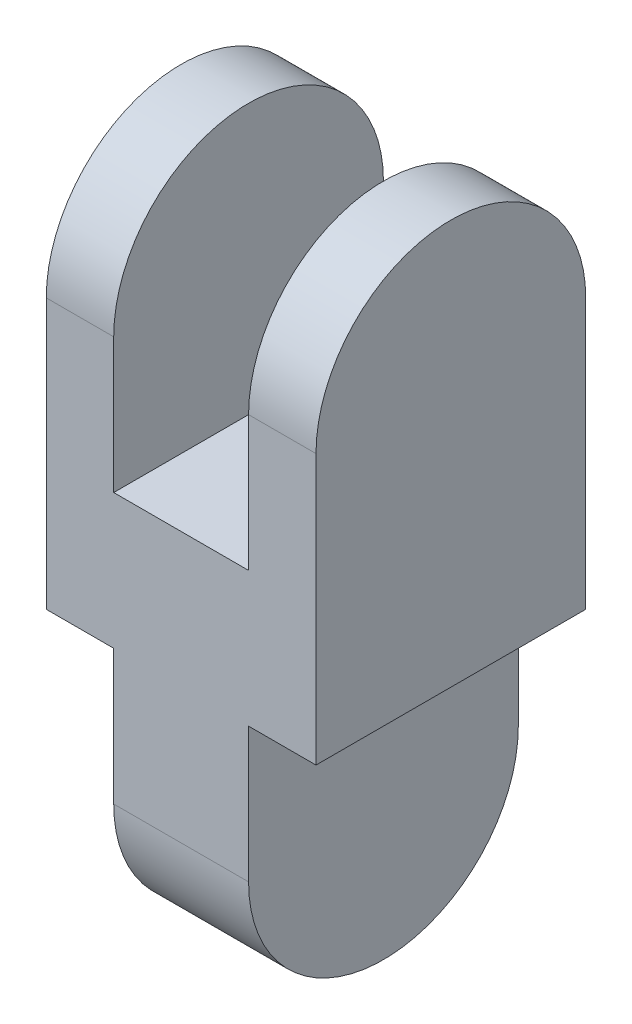
ISO-10303-21;
HEADER;
FILE_DESCRIPTION(('STEP AP214'),'2;1');
FILE_NAME('part.step','',(''),(''),'','','');
FILE_SCHEMA(('AUTOMOTIVE_DESIGN { 1 0 10303 214 1 1 1 1 }'));
ENDSEC;
DATA;
#1=APPLICATION_CONTEXT('core data for automotive mechanical design processes');
#2=APPLICATION_PROTOCOL_DEFINITION('international standard','automotive_design',2000,#1);
#3=PRODUCT_CONTEXT('',#1,'mechanical');
#4=PRODUCT('Part','Part','',(#3));
#5=PRODUCT_RELATED_PRODUCT_CATEGORY('part','',(#4));
#6=PRODUCT_DEFINITION_FORMATION('','',#4);
#7=PRODUCT_DEFINITION_CONTEXT('part definition',#1,'design');
#8=PRODUCT_DEFINITION('design','',#6,#7);
#9=PRODUCT_DEFINITION_SHAPE('','',#8);
#10=(LENGTH_UNIT() NAMED_UNIT(*) SI_UNIT(.MILLI.,.METRE.));
#11=(NAMED_UNIT(*) PLANE_ANGLE_UNIT() SI_UNIT($,.RADIAN.));
#12=(NAMED_UNIT(*) SI_UNIT($,.STERADIAN.) SOLID_ANGLE_UNIT());
#13=UNCERTAINTY_MEASURE_WITH_UNIT(LENGTH_MEASURE(1.E-05),#10,'distance_accuracy_value','');
#14=(GEOMETRIC_REPRESENTATION_CONTEXT(3) GLOBAL_UNCERTAINTY_ASSIGNED_CONTEXT((#13)) GLOBAL_UNIT_ASSIGNED_CONTEXT((#10,
#11,#12)) REPRESENTATION_CONTEXT('',''));
#15=CARTESIAN_POINT('',(0.,0.,0.));
#16=DIRECTION('',(0.,0.,1.));
#17=DIRECTION('',(1.,0.,0.));
#18=AXIS2_PLACEMENT_3D('',#15,#16,#17);
#19=CARTESIAN_POINT('',(-8.,40.,-8.));
#20=DIRECTION('',(0.,0.,1.));
#21=DIRECTION('',(1.,0.,0.));
#22=AXIS2_PLACEMENT_3D('',#19,#20,#21);
#23=PLANE('',#22);
#24=DIRECTION('',(0.,1.,0.));
#25=VECTOR('',#24,1.);
#26=CARTESIAN_POINT('',(-4.,32.,-8.00000000000001));
#27=LINE('',#26,#25);
#28=CARTESIAN_POINT('',(-4.,24.,-8.00000000000001));
#29=VERTEX_POINT('',#28);
#30=CARTESIAN_POINT('',(-4.,32.,-8.00000000000001));
#31=VERTEX_POINT('',#30);
#32=EDGE_CURVE('E135',#29,#31,#27,.T.);
#33=ORIENTED_EDGE('',*,*,#32,.F.);
#34=DIRECTION('',(1.,0.,0.));
#35=VECTOR('',#34,1.);
#36=CARTESIAN_POINT('',(-4.,24.,-8.00000000000001));
#37=LINE('',#36,#35);
#38=CARTESIAN_POINT('',(4.,24.,-8.00000000000001));
#39=VERTEX_POINT('',#38);
#40=EDGE_CURVE('E238',#29,#39,#37,.T.);
#41=ORIENTED_EDGE('',*,*,#40,.T.);
#42=DIRECTION('',(0.,1.,0.));
#43=VECTOR('',#42,1.);
#44=CARTESIAN_POINT('',(4.,32.,-8.00000000000001));
#45=LINE('',#44,#43);
#46=CARTESIAN_POINT('',(4.,32.,-8.00000000000001));
#47=VERTEX_POINT('',#46);
#48=EDGE_CURVE('E139',#39,#47,#45,.T.);
#49=ORIENTED_EDGE('',*,*,#48,.T.);
#50=DIRECTION('',(1.,0.,0.));
#51=VECTOR('',#50,1.);
#52=CARTESIAN_POINT('',(-8.00000000000001,32.,-8.));
#53=LINE('',#52,#51);
#54=CARTESIAN_POINT('',(8.,32.,-8.));
#55=VERTEX_POINT('',#54);
#56=EDGE_CURVE('E61',#47,#55,#53,.T.);
#57=ORIENTED_EDGE('',*,*,#56,.T.);
#58=DIRECTION('',(0.,-1.,0.));
#59=VECTOR('',#58,1.);
#60=CARTESIAN_POINT('',(8.,40.,-8.));
#61=LINE('',#60,#59);
#62=CARTESIAN_POINT('',(8.,16.,-8.00000000000001));
#63=VERTEX_POINT('',#62);
#64=EDGE_CURVE('E206',#55,#63,#61,.T.);
#65=ORIENTED_EDGE('',*,*,#64,.T.);
#66=DIRECTION('',(1.,0.,0.));
#67=VECTOR('',#66,1.);
#68=CARTESIAN_POINT('',(4.,16.,-8.00000000000001));
#69=LINE('',#68,#67);
#70=CARTESIAN_POINT('',(4.,16.,-8.00000000000001));
#71=VERTEX_POINT('',#70);
#72=EDGE_CURVE('E172',#71,#63,#69,.T.);
#73=ORIENTED_EDGE('',*,*,#72,.F.);
#74=DIRECTION('',(0.,1.,0.));
#75=VECTOR('',#74,1.);
#76=CARTESIAN_POINT('',(4.,8.,-8.00000000000001));
#77=LINE('',#76,#75);
#78=CARTESIAN_POINT('',(4.,8.,-8.));
#79=VERTEX_POINT('',#78);
#80=EDGE_CURVE('E165',#79,#71,#77,.T.);
#81=ORIENTED_EDGE('',*,*,#80,.F.);
#82=DIRECTION('',(1.,0.,0.));
#83=VECTOR('',#82,1.);
#84=CARTESIAN_POINT('',(-32.,8.,-7.99999999999999));
#85=LINE('',#84,#83);
#86=CARTESIAN_POINT('',(-4.,8.,-8.));
#87=VERTEX_POINT('',#86);
#88=EDGE_CURVE('E199',#87,#79,#85,.T.);
#89=ORIENTED_EDGE('',*,*,#88,.F.);
#90=DIRECTION('',(0.,-1.,0.));
#91=VECTOR('',#90,1.);
#92=CARTESIAN_POINT('',(-4.,8.,-8.));
#93=LINE('',#92,#91);
#94=CARTESIAN_POINT('',(-4.,16.,-8.));
#95=VERTEX_POINT('',#94);
#96=EDGE_CURVE('E188',#95,#87,#93,.T.);
#97=ORIENTED_EDGE('',*,*,#96,.F.);
#98=DIRECTION('',(-1.,0.,0.));
#99=VECTOR('',#98,1.);
#100=CARTESIAN_POINT('',(-4.,16.,-8.));
#101=LINE('',#100,#99);
#102=CARTESIAN_POINT('',(-8.,16.,-8.));
#103=VERTEX_POINT('',#102);
#104=EDGE_CURVE('E193',#95,#103,#101,.T.);
#105=ORIENTED_EDGE('',*,*,#104,.T.);
#106=DIRECTION('',(0.,-1.,0.));
#107=VECTOR('',#106,1.);
#108=CARTESIAN_POINT('',(-8.,40.,-8.));
#109=LINE('',#108,#107);
#110=CARTESIAN_POINT('',(-8.00000000000001,32.,-8.));
#111=VERTEX_POINT('',#110);
#112=EDGE_CURVE('E202',#111,#103,#109,.T.);
#113=ORIENTED_EDGE('',*,*,#112,.F.);
#114=EDGE_CURVE('E158',#111,#31,#53,.T.);
#115=ORIENTED_EDGE('',*,*,#114,.T.);
#116=EDGE_LOOP('',(#33,#41,#49,#57,#65,#73,#81,#89,#97,#105,#113,#115));
#117=FACE_BOUND('',#116,.T.);
#118=ADVANCED_FACE('F38',(#117),#23,.F.);
#119=CARTESIAN_POINT('',(-8.,40.,8.));
#120=DIRECTION('',(0.,0.,-1.));
#121=DIRECTION('',(-1.,0.,0.));
#122=AXIS2_PLACEMENT_3D('',#119,#120,#121);
#123=PLANE('',#122);
#124=DIRECTION('',(0.,-1.,0.));
#125=VECTOR('',#124,1.);
#126=CARTESIAN_POINT('',(-4.,32.,8.));
#127=LINE('',#126,#125);
#128=CARTESIAN_POINT('',(-4.,32.,8.));
#129=VERTEX_POINT('',#128);
#130=CARTESIAN_POINT('',(-4.,24.,8.));
#131=VERTEX_POINT('',#130);
#132=EDGE_CURVE('E132',#129,#131,#127,.T.);
#133=ORIENTED_EDGE('',*,*,#132,.F.);
#134=DIRECTION('',(1.,0.,0.));
#135=VECTOR('',#134,1.);
#136=CARTESIAN_POINT('',(-8.,32.,8.));
#137=LINE('',#136,#135);
#138=CARTESIAN_POINT('',(-8.,32.,8.));
#139=VERTEX_POINT('',#138);
#140=EDGE_CURVE('E144',#139,#129,#137,.T.);
#141=ORIENTED_EDGE('',*,*,#140,.F.);
#142=DIRECTION('',(0.,-1.,0.));
#143=VECTOR('',#142,1.);
#144=CARTESIAN_POINT('',(-8.,40.,8.));
#145=LINE('',#144,#143);
#146=CARTESIAN_POINT('',(-8.,16.,8.));
#147=VERTEX_POINT('',#146);
#148=EDGE_CURVE('E11',#139,#147,#145,.T.);
#149=ORIENTED_EDGE('',*,*,#148,.T.);
#150=DIRECTION('',(-1.,0.,0.));
#151=VECTOR('',#150,1.);
#152=CARTESIAN_POINT('',(-4.,16.,8.));
#153=LINE('',#152,#151);
#154=CARTESIAN_POINT('',(-4.,16.,8.));
#155=VERTEX_POINT('',#154);
#156=EDGE_CURVE('E190',#155,#147,#153,.T.);
#157=ORIENTED_EDGE('',*,*,#156,.F.);
#158=DIRECTION('',(0.,1.,0.));
#159=VECTOR('',#158,1.);
#160=CARTESIAN_POINT('',(-4.,8.,8.));
#161=LINE('',#160,#159);
#162=CARTESIAN_POINT('',(-4.,8.,8.));
#163=VERTEX_POINT('',#162);
#164=EDGE_CURVE('E182',#163,#155,#161,.T.);
#165=ORIENTED_EDGE('',*,*,#164,.F.);
#166=DIRECTION('',(1.,0.,0.));
#167=VECTOR('',#166,1.);
#168=CARTESIAN_POINT('',(-32.,8.,8.00000000000001));
#169=LINE('',#168,#167);
#170=CARTESIAN_POINT('',(4.,8.,8.));
#171=VERTEX_POINT('',#170);
#172=EDGE_CURVE('E196',#163,#171,#169,.T.);
#173=ORIENTED_EDGE('',*,*,#172,.T.);
#174=DIRECTION('',(0.,-1.,0.));
#175=VECTOR('',#174,1.);
#176=CARTESIAN_POINT('',(4.,8.,8.));
#177=LINE('',#176,#175);
#178=CARTESIAN_POINT('',(4.,16.,8.));
#179=VERTEX_POINT('',#178);
#180=EDGE_CURVE('E171',#179,#171,#177,.T.);
#181=ORIENTED_EDGE('',*,*,#180,.F.);
#182=DIRECTION('',(1.,0.,0.));
#183=VECTOR('',#182,1.);
#184=CARTESIAN_POINT('',(4.,16.,8.));
#185=LINE('',#184,#183);
#186=CARTESIAN_POINT('',(8.,16.,8.));
#187=VERTEX_POINT('',#186);
#188=EDGE_CURVE('E174',#179,#187,#185,.T.);
#189=ORIENTED_EDGE('',*,*,#188,.T.);
#190=DIRECTION('',(0.,-1.,0.));
#191=VECTOR('',#190,1.);
#192=CARTESIAN_POINT('',(8.,40.,8.));
#193=LINE('',#192,#191);
#194=CARTESIAN_POINT('',(8.,32.,8.));
#195=VERTEX_POINT('',#194);
#196=EDGE_CURVE('E46',#195,#187,#193,.T.);
#197=ORIENTED_EDGE('',*,*,#196,.F.);
#198=CARTESIAN_POINT('',(4.,32.,8.));
#199=VERTEX_POINT('',#198);
#200=EDGE_CURVE('E153',#199,#195,#137,.T.);
#201=ORIENTED_EDGE('',*,*,#200,.F.);
#202=DIRECTION('',(0.,-1.,0.));
#203=VECTOR('',#202,1.);
#204=CARTESIAN_POINT('',(4.,32.,8.));
#205=LINE('',#204,#203);
#206=CARTESIAN_POINT('',(4.,24.,8.));
#207=VERTEX_POINT('',#206);
#208=EDGE_CURVE('E53',#199,#207,#205,.T.);
#209=ORIENTED_EDGE('',*,*,#208,.T.);
#210=DIRECTION('',(1.,0.,0.));
#211=VECTOR('',#210,1.);
#212=CARTESIAN_POINT('',(-4.,24.,8.));
#213=LINE('',#212,#211);
#214=EDGE_CURVE('E146',#131,#207,#213,.T.);
#215=ORIENTED_EDGE('',*,*,#214,.F.);
#216=EDGE_LOOP('',(#133,#141,#149,#157,#165,#173,#181,#189,#197,#201,#209,#215));
#217=FACE_BOUND('',#216,.T.);
#218=ADVANCED_FACE('F143',(#217),#123,.F.);
#219=CARTESIAN_POINT('',(-8.,32.,0.));
#220=DIRECTION('',(1.,0.,0.));
#221=DIRECTION('',(0.,0.,-1.));
#222=AXIS2_PLACEMENT_3D('',#219,#220,#221);
#223=CYLINDRICAL_SURFACE('',#222,8.);
#224=CARTESIAN_POINT('',(-4.,32.,0.));
#225=DIRECTION('',(1.,0.,0.));
#226=DIRECTION('',(0.,0.,-1.));
#227=AXIS2_PLACEMENT_3D('',#224,#225,#226);
#228=CIRCLE('',#227,8.);
#229=EDGE_CURVE('E128',#31,#129,#228,.T.);
#230=ORIENTED_EDGE('',*,*,#229,.F.);
#231=ORIENTED_EDGE('',*,*,#114,.F.);
#232=CARTESIAN_POINT('',(-8.,32.,0.));
#233=DIRECTION('',(-1.,0.,0.));
#234=DIRECTION('',(0.,0.,-1.));
#235=AXIS2_PLACEMENT_3D('',#232,#233,#234);
#236=CIRCLE('',#235,8.);
#237=EDGE_CURVE('E151',#139,#111,#236,.T.);
#238=ORIENTED_EDGE('',*,*,#237,.F.);
#239=ORIENTED_EDGE('',*,*,#140,.T.);
#240=EDGE_LOOP('',(#230,#231,#238,#239));
#241=FACE_BOUND('',#240,.T.);
#242=ADVANCED_FACE('F149',(#241),#223,.T.);
#243=CARTESIAN_POINT('',(-32.,8.,0.));
#244=DIRECTION('',(1.,0.,0.));
#245=DIRECTION('',(0.,0.,-1.));
#246=AXIS2_PLACEMENT_3D('',#243,#244,#245);
#247=CYLINDRICAL_SURFACE('',#246,8.);
#248=CARTESIAN_POINT('',(4.,8.,0.));
#249=DIRECTION('',(1.,0.,0.));
#250=DIRECTION('',(0.,0.,-1.));
#251=AXIS2_PLACEMENT_3D('',#248,#249,#250);
#252=CIRCLE('',#251,8.);
#253=EDGE_CURVE('E156',#171,#79,#252,.T.);
#254=ORIENTED_EDGE('',*,*,#253,.F.);
#255=ORIENTED_EDGE('',*,*,#172,.F.);
#256=CARTESIAN_POINT('',(-4.,8.,0.));
#257=DIRECTION('',(-1.,0.,0.));
#258=DIRECTION('',(0.,0.,1.));
#259=AXIS2_PLACEMENT_3D('',#256,#257,#258);
#260=CIRCLE('',#259,8.);
#261=EDGE_CURVE('E180',#87,#163,#260,.T.);
#262=ORIENTED_EDGE('',*,*,#261,.F.);
#263=ORIENTED_EDGE('',*,*,#88,.T.);
#264=EDGE_LOOP('',(#254,#255,#262,#263));
#265=FACE_BOUND('',#264,.T.);
#266=ADVANCED_FACE('F225',(#265),#247,.T.);
#267=CARTESIAN_POINT('',(-8.,40.,-8.));
#268=DIRECTION('',(1.,0.,0.));
#269=DIRECTION('',(0.,0.,-1.));
#270=AXIS2_PLACEMENT_3D('',#267,#268,#269);
#271=PLANE('',#270);
#272=ORIENTED_EDGE('',*,*,#148,.F.);
#273=ORIENTED_EDGE('',*,*,#237,.T.);
#274=ORIENTED_EDGE('',*,*,#112,.T.);
#275=DIRECTION('',(0.,0.,-1.));
#276=VECTOR('',#275,1.);
#277=CARTESIAN_POINT('',(-8.,16.,-8.));
#278=LINE('',#277,#276);
#279=EDGE_CURVE('E177',#147,#103,#278,.T.);
#280=ORIENTED_EDGE('',*,*,#279,.F.);
#281=EDGE_LOOP('',(#272,#273,#274,#280));
#282=FACE_BOUND('',#281,.T.);
#283=ADVANCED_FACE('F40',(#282),#271,.F.);
#284=CARTESIAN_POINT('',(8.,40.,-8.));
#285=DIRECTION('',(-1.,0.,0.));
#286=DIRECTION('',(0.,0.,1.));
#287=AXIS2_PLACEMENT_3D('',#284,#285,#286);
#288=PLANE('',#287);
#289=ORIENTED_EDGE('',*,*,#64,.F.);
#290=CARTESIAN_POINT('',(8.,32.,0.));
#291=DIRECTION('',(-1.,0.,0.));
#292=DIRECTION('',(0.,0.,-1.));
#293=AXIS2_PLACEMENT_3D('',#290,#291,#292);
#294=CIRCLE('',#293,8.);
#295=EDGE_CURVE('E161',#195,#55,#294,.T.);
#296=ORIENTED_EDGE('',*,*,#295,.F.);
#297=ORIENTED_EDGE('',*,*,#196,.T.);
#298=DIRECTION('',(0.,0.,1.));
#299=VECTOR('',#298,1.);
#300=CARTESIAN_POINT('',(8.,16.,8.));
#301=LINE('',#300,#299);
#302=EDGE_CURVE('E152',#63,#187,#301,.T.);
#303=ORIENTED_EDGE('',*,*,#302,.F.);
#304=EDGE_LOOP('',(#289,#296,#297,#303));
#305=FACE_BOUND('',#304,.T.);
#306=ADVANCED_FACE('F212',(#305),#288,.F.);
#307=CARTESIAN_POINT('',(-4.,16.,-8.));
#308=DIRECTION('',(0.,1.,0.));
#309=DIRECTION('',(0.,0.,1.));
#310=AXIS2_PLACEMENT_3D('',#307,#308,#309);
#311=PLANE('',#310);
#312=ORIENTED_EDGE('',*,*,#279,.T.);
#313=ORIENTED_EDGE('',*,*,#104,.F.);
#314=DIRECTION('',(0.,0.,-1.));
#315=VECTOR('',#314,1.);
#316=CARTESIAN_POINT('',(-4.,16.,-8.));
#317=LINE('',#316,#315);
#318=EDGE_CURVE('E185',#155,#95,#317,.T.);
#319=ORIENTED_EDGE('',*,*,#318,.F.);
#320=ORIENTED_EDGE('',*,*,#156,.T.);
#321=EDGE_LOOP('',(#312,#313,#319,#320));
#322=FACE_BOUND('',#321,.T.);
#323=ADVANCED_FACE('F234',(#322),#311,.F.);
#324=CARTESIAN_POINT('',(-4.,8.,0.));
#325=DIRECTION('',(-1.,0.,0.));
#326=DIRECTION('',(0.,0.,1.));
#327=AXIS2_PLACEMENT_3D('',#324,#325,#326);
#328=PLANE('',#327);
#329=ORIENTED_EDGE('',*,*,#261,.T.);
#330=ORIENTED_EDGE('',*,*,#164,.T.);
#331=ORIENTED_EDGE('',*,*,#318,.T.);
#332=ORIENTED_EDGE('',*,*,#96,.T.);
#333=EDGE_LOOP('',(#329,#330,#331,#332));
#334=FACE_BOUND('',#333,.T.);
#335=ADVANCED_FACE('F231',(#334),#328,.T.);
#336=CARTESIAN_POINT('',(4.,16.,8.));
#337=DIRECTION('',(0.,1.,0.));
#338=DIRECTION('',(0.,0.,1.));
#339=AXIS2_PLACEMENT_3D('',#336,#337,#338);
#340=PLANE('',#339);
#341=ORIENTED_EDGE('',*,*,#302,.T.);
#342=ORIENTED_EDGE('',*,*,#188,.F.);
#343=DIRECTION('',(0.,0.,1.));
#344=VECTOR('',#343,1.);
#345=CARTESIAN_POINT('',(4.,16.,8.));
#346=LINE('',#345,#344);
#347=EDGE_CURVE('E168',#71,#179,#346,.T.);
#348=ORIENTED_EDGE('',*,*,#347,.F.);
#349=ORIENTED_EDGE('',*,*,#72,.T.);
#350=EDGE_LOOP('',(#341,#342,#348,#349));
#351=FACE_BOUND('',#350,.T.);
#352=ADVANCED_FACE('F215',(#351),#340,.F.);
#353=CARTESIAN_POINT('',(4.,8.,0.));
#354=DIRECTION('',(1.,0.,0.));
#355=DIRECTION('',(0.,0.,-1.));
#356=AXIS2_PLACEMENT_3D('',#353,#354,#355);
#357=PLANE('',#356);
#358=ORIENTED_EDGE('',*,*,#253,.T.);
#359=ORIENTED_EDGE('',*,*,#80,.T.);
#360=ORIENTED_EDGE('',*,*,#347,.T.);
#361=ORIENTED_EDGE('',*,*,#180,.T.);
#362=EDGE_LOOP('',(#358,#359,#360,#361));
#363=FACE_BOUND('',#362,.T.);
#364=ADVANCED_FACE('F222',(#363),#357,.T.);
#365=ORIENTED_EDGE('',*,*,#56,.F.);
#366=CARTESIAN_POINT('',(4.,32.,0.));
#367=DIRECTION('',(1.,0.,0.));
#368=DIRECTION('',(0.,0.,-1.));
#369=AXIS2_PLACEMENT_3D('',#366,#367,#368);
#370=CIRCLE('',#369,8.);
#371=EDGE_CURVE('E243',#47,#199,#370,.T.);
#372=ORIENTED_EDGE('',*,*,#371,.T.);
#373=ORIENTED_EDGE('',*,*,#200,.T.);
#374=ORIENTED_EDGE('',*,*,#295,.T.);
#375=EDGE_LOOP('',(#365,#372,#373,#374));
#376=FACE_BOUND('',#375,.T.);
#377=ADVANCED_FACE('F250',(#376),#223,.T.);
#378=CARTESIAN_POINT('',(-4.,24.,8.));
#379=DIRECTION('',(0.,-1.,0.));
#380=DIRECTION('',(0.,0.,-1.));
#381=AXIS2_PLACEMENT_3D('',#378,#379,#380);
#382=PLANE('',#381);
#383=DIRECTION('',(0.,0.,-1.));
#384=VECTOR('',#383,1.);
#385=CARTESIAN_POINT('',(4.,24.,8.));
#386=LINE('',#385,#384);
#387=EDGE_CURVE('E246',#207,#39,#386,.T.);
#388=ORIENTED_EDGE('',*,*,#387,.T.);
#389=ORIENTED_EDGE('',*,*,#40,.F.);
#390=DIRECTION('',(0.,0.,-1.));
#391=VECTOR('',#390,1.);
#392=CARTESIAN_POINT('',(-4.,24.,8.));
#393=LINE('',#392,#391);
#394=EDGE_CURVE('E147',#131,#29,#393,.T.);
#395=ORIENTED_EDGE('',*,*,#394,.F.);
#396=ORIENTED_EDGE('',*,*,#214,.T.);
#397=EDGE_LOOP('',(#388,#389,#395,#396));
#398=FACE_BOUND('',#397,.T.);
#399=ADVANCED_FACE('F254',(#398),#382,.F.);
#400=CARTESIAN_POINT('',(-4.,32.,0.));
#401=DIRECTION('',(1.,0.,0.));
#402=DIRECTION('',(0.,0.,-1.));
#403=AXIS2_PLACEMENT_3D('',#400,#401,#402);
#404=PLANE('',#403);
#405=ORIENTED_EDGE('',*,*,#229,.T.);
#406=ORIENTED_EDGE('',*,*,#132,.T.);
#407=ORIENTED_EDGE('',*,*,#394,.T.);
#408=ORIENTED_EDGE('',*,*,#32,.T.);
#409=EDGE_LOOP('',(#405,#406,#407,#408));
#410=FACE_BOUND('',#409,.T.);
#411=ADVANCED_FACE('F130',(#410),#404,.T.);
#412=CARTESIAN_POINT('',(4.,32.,0.));
#413=DIRECTION('',(1.,0.,0.));
#414=DIRECTION('',(0.,0.,-1.));
#415=AXIS2_PLACEMENT_3D('',#412,#413,#414);
#416=PLANE('',#415);
#417=ORIENTED_EDGE('',*,*,#371,.F.);
#418=ORIENTED_EDGE('',*,*,#48,.F.);
#419=ORIENTED_EDGE('',*,*,#387,.F.);
#420=ORIENTED_EDGE('',*,*,#208,.F.);
#421=EDGE_LOOP('',(#417,#418,#419,#420));
#422=FACE_BOUND('',#421,.T.);
#423=ADVANCED_FACE('F252',(#422),#416,.F.);
#424=CLOSED_SHELL('',(#118,#218,#242,#266,#283,#306,#323,#335,#352,#364,#377,#399,#411,#423));
#425=MANIFOLD_SOLID_BREP('B2',#424);
#426=ADVANCED_BREP_SHAPE_REPRESENTATION('',(#18,#425),#14);
#427=SHAPE_DEFINITION_REPRESENTATION(#9,#426);
ENDSEC;
END-ISO-10303-21;
